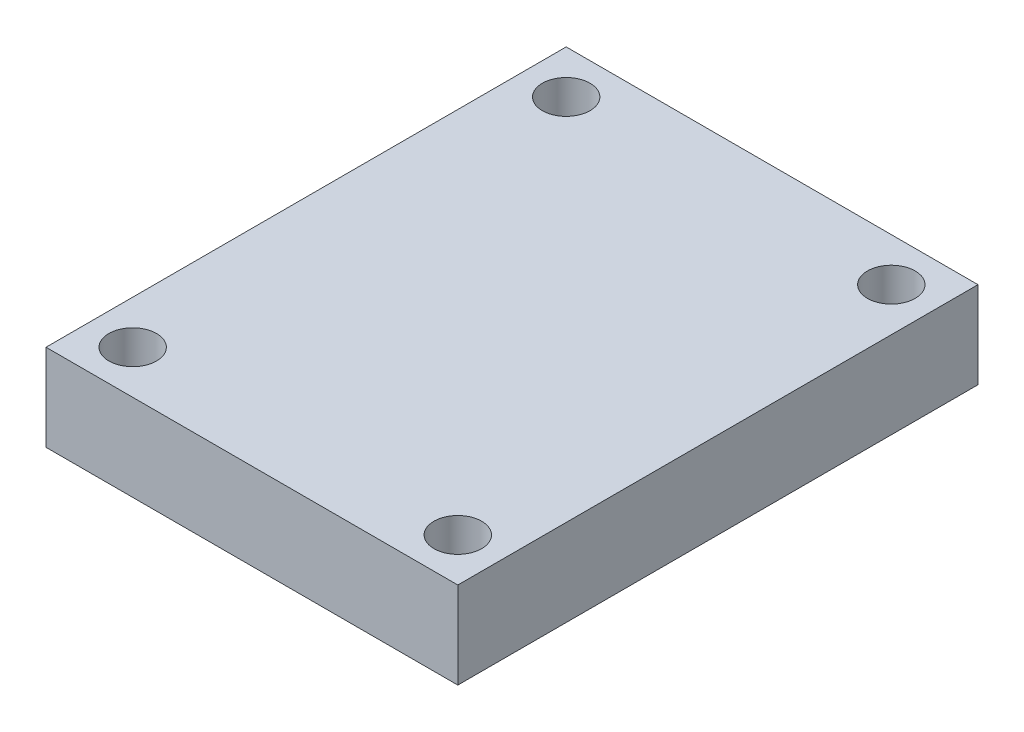
ISO-10303-21;
HEADER;
FILE_DESCRIPTION(('STEP AP214'),'2;1');
FILE_NAME('part.step','',(''),(''),'','','');
FILE_SCHEMA(('AUTOMOTIVE_DESIGN { 1 0 10303 214 1 1 1 1 }'));
ENDSEC;
DATA;
#1=APPLICATION_CONTEXT('core data for automotive mechanical design processes');
#2=APPLICATION_PROTOCOL_DEFINITION('international standard','automotive_design',2000,#1);
#3=PRODUCT_CONTEXT('',#1,'mechanical');
#4=PRODUCT('Part','Part','',(#3));
#5=PRODUCT_RELATED_PRODUCT_CATEGORY('part','',(#4));
#6=PRODUCT_DEFINITION_FORMATION('','',#4);
#7=PRODUCT_DEFINITION_CONTEXT('part definition',#1,'design');
#8=PRODUCT_DEFINITION('design','',#6,#7);
#9=PRODUCT_DEFINITION_SHAPE('','',#8);
#10=(LENGTH_UNIT() NAMED_UNIT(*) SI_UNIT(.MILLI.,.METRE.));
#11=(NAMED_UNIT(*) PLANE_ANGLE_UNIT() SI_UNIT($,.RADIAN.));
#12=(NAMED_UNIT(*) SI_UNIT($,.STERADIAN.) SOLID_ANGLE_UNIT());
#13=UNCERTAINTY_MEASURE_WITH_UNIT(LENGTH_MEASURE(1.E-05),#10,'distance_accuracy_value','');
#14=(GEOMETRIC_REPRESENTATION_CONTEXT(3) GLOBAL_UNCERTAINTY_ASSIGNED_CONTEXT((#13)) GLOBAL_UNIT_ASSIGNED_CONTEXT((#10,
#11,#12)) REPRESENTATION_CONTEXT('',''));
#15=CARTESIAN_POINT('',(0.,0.,0.));
#16=DIRECTION('',(0.,0.,1.));
#17=DIRECTION('',(1.,0.,0.));
#18=AXIS2_PLACEMENT_3D('',#15,#16,#17);
#19=CARTESIAN_POINT('',(0.,8.,0.));
#20=DIRECTION('',(0.,1.,0.));
#21=DIRECTION('',(0.,0.,1.));
#22=AXIS2_PLACEMENT_3D('',#19,#20,#21);
#23=PLANE('',#22);
#24=CARTESIAN_POINT('',(-34.,8.,-4.));
#25=DIRECTION('',(0.,1.,0.));
#26=DIRECTION('',(0.,0.,1.));
#27=AXIS2_PLACEMENT_3D('',#24,#25,#26);
#28=CIRCLE('',#27,2.2);
#29=CARTESIAN_POINT('',(-34.,8.,-1.8));
#30=VERTEX_POINT('',#29);
#31=EDGE_CURVE('E177',#30,#30,#28,.T.);
#32=ORIENTED_EDGE('',*,*,#31,.F.);
#33=EDGE_LOOP('',(#32));
#34=FACE_BOUND('',#33,.T.);
#35=CARTESIAN_POINT('',(-4.,8.,-4.));
#36=DIRECTION('',(0.,1.,0.));
#37=DIRECTION('',(0.,0.,1.));
#38=AXIS2_PLACEMENT_3D('',#35,#36,#37);
#39=CIRCLE('',#38,2.2);
#40=CARTESIAN_POINT('',(-4.,8.,-1.8));
#41=VERTEX_POINT('',#40);
#42=EDGE_CURVE('E114',#41,#41,#39,.T.);
#43=ORIENTED_EDGE('',*,*,#42,.F.);
#44=EDGE_LOOP('',(#43));
#45=FACE_BOUND('',#44,.T.);
#46=DIRECTION('',(1.,0.,0.));
#47=VECTOR('',#46,1.);
#48=CARTESIAN_POINT('',(-8.,8.,0.));
#49=LINE('',#48,#47);
#50=CARTESIAN_POINT('',(-38.,8.,0.));
#51=VERTEX_POINT('',#50);
#52=CARTESIAN_POINT('',(0.,8.,0.));
#53=VERTEX_POINT('',#52);
#54=EDGE_CURVE('E58',#51,#53,#49,.T.);
#55=ORIENTED_EDGE('',*,*,#54,.T.);
#56=DIRECTION('',(0.,0.,-1.));
#57=VECTOR('',#56,1.);
#58=CARTESIAN_POINT('',(0.,8.,0.));
#59=LINE('',#58,#57);
#60=CARTESIAN_POINT('',(0.,8.,-48.));
#61=VERTEX_POINT('',#60);
#62=EDGE_CURVE('E89',#53,#61,#59,.T.);
#63=ORIENTED_EDGE('',*,*,#62,.T.);
#64=DIRECTION('',(-1.,0.,0.));
#65=VECTOR('',#64,1.);
#66=CARTESIAN_POINT('',(0.,8.,-48.));
#67=LINE('',#66,#65);
#68=CARTESIAN_POINT('',(-38.,8.,-48.));
#69=VERTEX_POINT('',#68);
#70=EDGE_CURVE('E93',#61,#69,#67,.T.);
#71=ORIENTED_EDGE('',*,*,#70,.T.);
#72=DIRECTION('',(0.,0.,1.));
#73=VECTOR('',#72,1.);
#74=CARTESIAN_POINT('',(-38.,8.,0.));
#75=LINE('',#74,#73);
#76=EDGE_CURVE('E103',#69,#51,#75,.T.);
#77=ORIENTED_EDGE('',*,*,#76,.T.);
#78=EDGE_LOOP('',(#55,#63,#71,#77));
#79=FACE_BOUND('',#78,.T.);
#80=CARTESIAN_POINT('',(-4.,8.,-44.));
#81=DIRECTION('',(0.,1.,0.));
#82=DIRECTION('',(0.,0.,1.));
#83=AXIS2_PLACEMENT_3D('',#80,#81,#82);
#84=CIRCLE('',#83,2.2);
#85=CARTESIAN_POINT('',(-4.,8.,-41.8));
#86=VERTEX_POINT('',#85);
#87=EDGE_CURVE('E185',#86,#86,#84,.T.);
#88=ORIENTED_EDGE('',*,*,#87,.F.);
#89=EDGE_LOOP('',(#88));
#90=FACE_BOUND('',#89,.T.);
#91=CARTESIAN_POINT('',(-34.,8.,-44.));
#92=DIRECTION('',(0.,1.,0.));
#93=DIRECTION('',(0.,0.,1.));
#94=AXIS2_PLACEMENT_3D('',#91,#92,#93);
#95=CIRCLE('',#94,2.2);
#96=CARTESIAN_POINT('',(-34.,8.,-41.8));
#97=VERTEX_POINT('',#96);
#98=EDGE_CURVE('E168',#97,#97,#95,.T.);
#99=ORIENTED_EDGE('',*,*,#98,.F.);
#100=EDGE_LOOP('',(#99));
#101=FACE_BOUND('',#100,.T.);
#102=ADVANCED_FACE('F40',(#34,#45,#79,#90,#101),#23,.T.);
#103=CARTESIAN_POINT('',(0.,0.,0.));
#104=DIRECTION('',(0.,1.,0.));
#105=DIRECTION('',(0.,0.,1.));
#106=AXIS2_PLACEMENT_3D('',#103,#104,#105);
#107=PLANE('',#106);
#108=DIRECTION('',(0.,0.,-1.));
#109=VECTOR('',#108,1.);
#110=CARTESIAN_POINT('',(0.,0.,0.));
#111=LINE('',#110,#109);
#112=CARTESIAN_POINT('',(0.,0.,0.));
#113=VERTEX_POINT('',#112);
#114=CARTESIAN_POINT('',(0.,0.,-48.));
#115=VERTEX_POINT('',#114);
#116=EDGE_CURVE('E97',#113,#115,#111,.T.);
#117=ORIENTED_EDGE('',*,*,#116,.F.);
#118=DIRECTION('',(1.,0.,0.));
#119=VECTOR('',#118,1.);
#120=CARTESIAN_POINT('',(-8.,0.,0.));
#121=LINE('',#120,#119);
#122=CARTESIAN_POINT('',(-38.,0.,0.));
#123=VERTEX_POINT('',#122);
#124=EDGE_CURVE('E82',#123,#113,#121,.T.);
#125=ORIENTED_EDGE('',*,*,#124,.F.);
#126=DIRECTION('',(0.,0.,1.));
#127=VECTOR('',#126,1.);
#128=CARTESIAN_POINT('',(-38.,0.,0.));
#129=LINE('',#128,#127);
#130=CARTESIAN_POINT('',(-38.,0.,-48.));
#131=VERTEX_POINT('',#130);
#132=EDGE_CURVE('E117',#131,#123,#129,.T.);
#133=ORIENTED_EDGE('',*,*,#132,.F.);
#134=DIRECTION('',(-1.,0.,0.));
#135=VECTOR('',#134,1.);
#136=CARTESIAN_POINT('',(-8.,0.,-48.));
#137=LINE('',#136,#135);
#138=EDGE_CURVE('E75',#115,#131,#137,.T.);
#139=ORIENTED_EDGE('',*,*,#138,.F.);
#140=EDGE_LOOP('',(#117,#125,#133,#139));
#141=FACE_BOUND('',#140,.T.);
#142=CARTESIAN_POINT('',(-4.,0.,-4.));
#143=DIRECTION('',(0.,1.,0.));
#144=DIRECTION('',(0.,0.,1.));
#145=AXIS2_PLACEMENT_3D('',#142,#143,#144);
#146=CIRCLE('',#145,2.2);
#147=CARTESIAN_POINT('',(-4.,0.,-1.8));
#148=VERTEX_POINT('',#147);
#149=EDGE_CURVE('E189',#148,#148,#146,.T.);
#150=ORIENTED_EDGE('',*,*,#149,.T.);
#151=EDGE_LOOP('',(#150));
#152=FACE_BOUND('',#151,.T.);
#153=CARTESIAN_POINT('',(-4.,0.,-44.));
#154=DIRECTION('',(0.,1.,0.));
#155=DIRECTION('',(0.,0.,1.));
#156=AXIS2_PLACEMENT_3D('',#153,#154,#155);
#157=CIRCLE('',#156,2.2);
#158=CARTESIAN_POINT('',(-4.,0.,-41.8));
#159=VERTEX_POINT('',#158);
#160=EDGE_CURVE('E181',#159,#159,#157,.T.);
#161=ORIENTED_EDGE('',*,*,#160,.T.);
#162=EDGE_LOOP('',(#161));
#163=FACE_BOUND('',#162,.T.);
#164=CARTESIAN_POINT('',(-34.,0.,-4.));
#165=DIRECTION('',(0.,1.,0.));
#166=DIRECTION('',(0.,0.,1.));
#167=AXIS2_PLACEMENT_3D('',#164,#165,#166);
#168=CIRCLE('',#167,2.2);
#169=CARTESIAN_POINT('',(-34.,0.,-1.8));
#170=VERTEX_POINT('',#169);
#171=EDGE_CURVE('E174',#170,#170,#168,.T.);
#172=ORIENTED_EDGE('',*,*,#171,.T.);
#173=EDGE_LOOP('',(#172));
#174=FACE_BOUND('',#173,.T.);
#175=CARTESIAN_POINT('',(-34.,0.,-44.));
#176=DIRECTION('',(0.,1.,0.));
#177=DIRECTION('',(0.,0.,1.));
#178=AXIS2_PLACEMENT_3D('',#175,#176,#177);
#179=CIRCLE('',#178,2.2);
#180=CARTESIAN_POINT('',(-34.,0.,-41.8));
#181=VERTEX_POINT('',#180);
#182=EDGE_CURVE('E171',#181,#181,#179,.T.);
#183=ORIENTED_EDGE('',*,*,#182,.T.);
#184=EDGE_LOOP('',(#183));
#185=FACE_BOUND('',#184,.T.);
#186=ADVANCED_FACE('F129',(#141,#152,#163,#174,#185),#107,.F.);
#187=CARTESIAN_POINT('',(0.,8.,0.));
#188=DIRECTION('',(-1.,0.,0.));
#189=DIRECTION('',(0.,0.,1.));
#190=AXIS2_PLACEMENT_3D('',#187,#188,#189);
#191=PLANE('',#190);
#192=ORIENTED_EDGE('',*,*,#116,.T.);
#193=DIRECTION('',(0.,-1.,0.));
#194=VECTOR('',#193,1.);
#195=CARTESIAN_POINT('',(0.,8.,-48.));
#196=LINE('',#195,#194);
#197=EDGE_CURVE('E50',#61,#115,#196,.T.);
#198=ORIENTED_EDGE('',*,*,#197,.F.);
#199=ORIENTED_EDGE('',*,*,#62,.F.);
#200=DIRECTION('',(0.,-1.,0.));
#201=VECTOR('',#200,1.);
#202=CARTESIAN_POINT('',(0.,8.,0.));
#203=LINE('',#202,#201);
#204=EDGE_CURVE('E11',#53,#113,#203,.T.);
#205=ORIENTED_EDGE('',*,*,#204,.T.);
#206=EDGE_LOOP('',(#192,#198,#199,#205));
#207=FACE_BOUND('',#206,.T.);
#208=ADVANCED_FACE('F42',(#207),#191,.F.);
#209=CARTESIAN_POINT('',(-8.,8.,-48.));
#210=DIRECTION('',(0.,0.,1.));
#211=DIRECTION('',(1.,0.,0.));
#212=AXIS2_PLACEMENT_3D('',#209,#210,#211);
#213=PLANE('',#212);
#214=ORIENTED_EDGE('',*,*,#138,.T.);
#215=DIRECTION('',(0.,-1.,0.));
#216=VECTOR('',#215,1.);
#217=CARTESIAN_POINT('',(-38.,8.,-48.));
#218=LINE('',#217,#216);
#219=EDGE_CURVE('E99',#69,#131,#218,.T.);
#220=ORIENTED_EDGE('',*,*,#219,.F.);
#221=ORIENTED_EDGE('',*,*,#70,.F.);
#222=ORIENTED_EDGE('',*,*,#197,.T.);
#223=EDGE_LOOP('',(#214,#220,#221,#222));
#224=FACE_BOUND('',#223,.T.);
#225=ADVANCED_FACE('F100',(#224),#213,.F.);
#226=CARTESIAN_POINT('',(-38.,8.,0.));
#227=DIRECTION('',(1.,0.,0.));
#228=DIRECTION('',(0.,0.,-1.));
#229=AXIS2_PLACEMENT_3D('',#226,#227,#228);
#230=PLANE('',#229);
#231=ORIENTED_EDGE('',*,*,#132,.T.);
#232=DIRECTION('',(0.,-1.,0.));
#233=VECTOR('',#232,1.);
#234=CARTESIAN_POINT('',(-38.,8.,0.));
#235=LINE('',#234,#233);
#236=EDGE_CURVE('E108',#51,#123,#235,.T.);
#237=ORIENTED_EDGE('',*,*,#236,.F.);
#238=ORIENTED_EDGE('',*,*,#76,.F.);
#239=ORIENTED_EDGE('',*,*,#219,.T.);
#240=EDGE_LOOP('',(#231,#237,#238,#239));
#241=FACE_BOUND('',#240,.T.);
#242=ADVANCED_FACE('F127',(#241),#230,.F.);
#243=CARTESIAN_POINT('',(-8.,8.,0.));
#244=DIRECTION('',(0.,0.,-1.));
#245=DIRECTION('',(-1.,0.,0.));
#246=AXIS2_PLACEMENT_3D('',#243,#244,#245);
#247=PLANE('',#246);
#248=ORIENTED_EDGE('',*,*,#124,.T.);
#249=ORIENTED_EDGE('',*,*,#204,.F.);
#250=ORIENTED_EDGE('',*,*,#54,.F.);
#251=ORIENTED_EDGE('',*,*,#236,.T.);
#252=EDGE_LOOP('',(#248,#249,#250,#251));
#253=FACE_BOUND('',#252,.T.);
#254=ADVANCED_FACE('F131',(#253),#247,.F.);
#255=CARTESIAN_POINT('',(-4.,8.,-4.));
#256=DIRECTION('',(0.,-1.,0.));
#257=DIRECTION('',(0.,0.,-1.));
#258=AXIS2_PLACEMENT_3D('',#255,#256,#257);
#259=CYLINDRICAL_SURFACE('',#258,2.2);
#260=ORIENTED_EDGE('',*,*,#42,.T.);
#261=EDGE_LOOP('',(#260));
#262=FACE_BOUND('',#261,.T.);
#263=ORIENTED_EDGE('',*,*,#149,.F.);
#264=EDGE_LOOP('',(#263));
#265=FACE_BOUND('',#264,.T.);
#266=ADVANCED_FACE('F133',(#262,#265),#259,.F.);
#267=CARTESIAN_POINT('',(-4.,8.,-44.));
#268=DIRECTION('',(0.,-1.,0.));
#269=DIRECTION('',(0.,0.,-1.));
#270=AXIS2_PLACEMENT_3D('',#267,#268,#269);
#271=CYLINDRICAL_SURFACE('',#270,2.2);
#272=ORIENTED_EDGE('',*,*,#87,.T.);
#273=EDGE_LOOP('',(#272));
#274=FACE_BOUND('',#273,.T.);
#275=ORIENTED_EDGE('',*,*,#160,.F.);
#276=EDGE_LOOP('',(#275));
#277=FACE_BOUND('',#276,.T.);
#278=ADVANCED_FACE('F139',(#274,#277),#271,.F.);
#279=CARTESIAN_POINT('',(-34.,8.,-4.));
#280=DIRECTION('',(0.,-1.,0.));
#281=DIRECTION('',(0.,0.,-1.));
#282=AXIS2_PLACEMENT_3D('',#279,#280,#281);
#283=CYLINDRICAL_SURFACE('',#282,2.2);
#284=ORIENTED_EDGE('',*,*,#31,.T.);
#285=EDGE_LOOP('',(#284));
#286=FACE_BOUND('',#285,.T.);
#287=ORIENTED_EDGE('',*,*,#171,.F.);
#288=EDGE_LOOP('',(#287));
#289=FACE_BOUND('',#288,.T.);
#290=ADVANCED_FACE('F155',(#286,#289),#283,.F.);
#291=CARTESIAN_POINT('',(-34.,8.,-44.));
#292=DIRECTION('',(0.,-1.,0.));
#293=DIRECTION('',(0.,0.,-1.));
#294=AXIS2_PLACEMENT_3D('',#291,#292,#293);
#295=CYLINDRICAL_SURFACE('',#294,2.2);
#296=ORIENTED_EDGE('',*,*,#98,.T.);
#297=EDGE_LOOP('',(#296));
#298=FACE_BOUND('',#297,.T.);
#299=ORIENTED_EDGE('',*,*,#182,.F.);
#300=EDGE_LOOP('',(#299));
#301=FACE_BOUND('',#300,.T.);
#302=ADVANCED_FACE('F159',(#298,#301),#295,.F.);
#303=CLOSED_SHELL('',(#102,#186,#208,#225,#242,#254,#266,#278,#290,#302));
#304=MANIFOLD_SOLID_BREP('B2',#303);
#305=ADVANCED_BREP_SHAPE_REPRESENTATION('',(#18,#304),#14);
#306=SHAPE_DEFINITION_REPRESENTATION(#9,#305);
ENDSEC;
END-ISO-10303-21;
